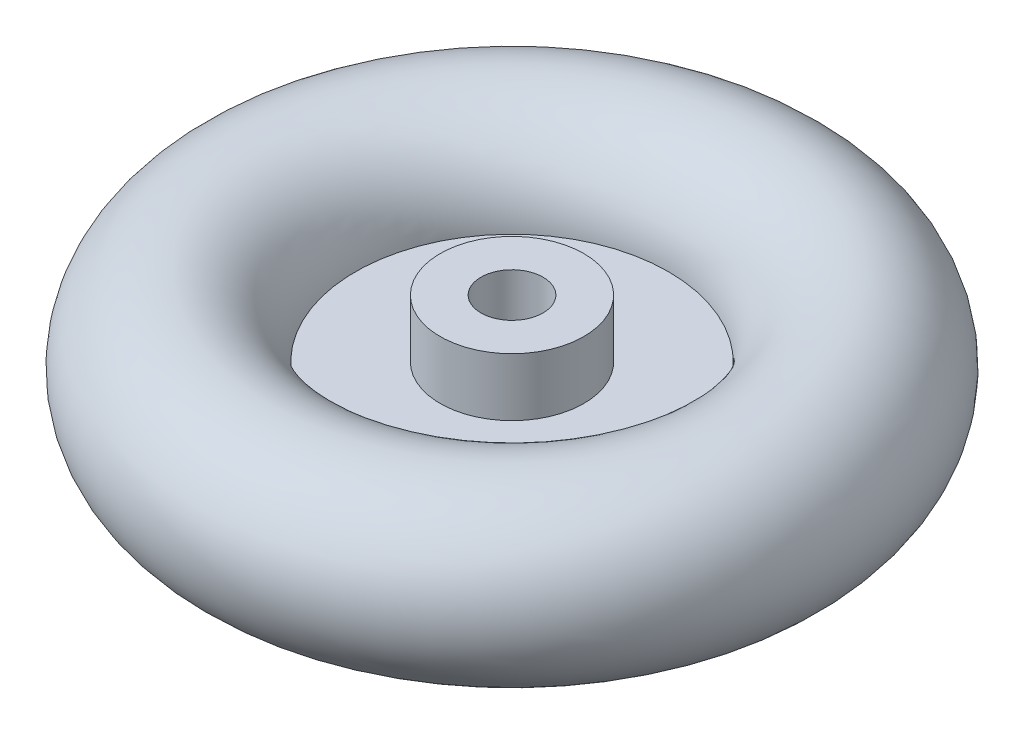
ISO-10303-21;
HEADER;
FILE_DESCRIPTION(('STEP AP214'),'2;1');
FILE_NAME('part.step','',(''),(''),'','','');
FILE_SCHEMA(('AUTOMOTIVE_DESIGN { 1 0 10303 214 1 1 1 1 }'));
ENDSEC;
DATA;
#1=APPLICATION_CONTEXT('core data for automotive mechanical design processes');
#2=APPLICATION_PROTOCOL_DEFINITION('international standard','automotive_design',2000,#1);
#3=PRODUCT_CONTEXT('',#1,'mechanical');
#4=PRODUCT('Part','Part','',(#3));
#5=PRODUCT_RELATED_PRODUCT_CATEGORY('part','',(#4));
#6=PRODUCT_DEFINITION_FORMATION('','',#4);
#7=PRODUCT_DEFINITION_CONTEXT('part definition',#1,'design');
#8=PRODUCT_DEFINITION('design','',#6,#7);
#9=PRODUCT_DEFINITION_SHAPE('','',#8);
#10=(LENGTH_UNIT() NAMED_UNIT(*) SI_UNIT(.MILLI.,.METRE.));
#11=(NAMED_UNIT(*) PLANE_ANGLE_UNIT() SI_UNIT($,.RADIAN.));
#12=(NAMED_UNIT(*) SI_UNIT($,.STERADIAN.) SOLID_ANGLE_UNIT());
#13=UNCERTAINTY_MEASURE_WITH_UNIT(LENGTH_MEASURE(1.E-05),#10,'distance_accuracy_value','');
#14=(GEOMETRIC_REPRESENTATION_CONTEXT(3) GLOBAL_UNCERTAINTY_ASSIGNED_CONTEXT((#13)) GLOBAL_UNIT_ASSIGNED_CONTEXT((#10,
#11,#12)) REPRESENTATION_CONTEXT('',''));
#15=CARTESIAN_POINT('',(0.,0.,0.));
#16=DIRECTION('',(0.,0.,1.));
#17=DIRECTION('',(1.,0.,0.));
#18=AXIS2_PLACEMENT_3D('',#15,#16,#17);
#19=CARTESIAN_POINT('',(-6.38024824366239,0.539107048537545,0.));
#20=DIRECTION('',(0.,-1.,0.));
#21=DIRECTION('',(0.,0.,-1.));
#22=AXIS2_PLACEMENT_3D('',#19,#20,#21);
#23=CYLINDRICAL_SURFACE('',#22,22.);
#24=CARTESIAN_POINT('',(-6.38024824366239,28.2494507563892,0.));
#25=DIRECTION('',(0.,-1.,0.));
#26=DIRECTION('',(0.,0.,-1.));
#27=AXIS2_PLACEMENT_3D('',#24,#25,#26);
#28=CIRCLE('',#27,22.);
#29=CARTESIAN_POINT('',(-6.38024824366239,28.2494507563892,-22.));
#30=VERTEX_POINT('',#29);
#31=EDGE_CURVE('E10',#30,#30,#28,.T.);
#32=ORIENTED_EDGE('',*,*,#31,.F.);
#33=EDGE_LOOP('',(#32));
#34=FACE_BOUND('',#33,.T.);
#35=CARTESIAN_POINT('',(-6.38024824366239,46.,0.));
#36=DIRECTION('',(0.,-1.,0.));
#37=DIRECTION('',(0.,0.,-1.));
#38=AXIS2_PLACEMENT_3D('',#35,#36,#37);
#39=CIRCLE('',#38,22.);
#40=CARTESIAN_POINT('',(-6.38024824366239,46.,-22.));
#41=VERTEX_POINT('',#40);
#42=EDGE_CURVE('E64',#41,#41,#39,.T.);
#43=ORIENTED_EDGE('',*,*,#42,.T.);
#44=EDGE_LOOP('',(#43));
#45=FACE_BOUND('',#44,.T.);
#46=ADVANCED_FACE('F36',(#34,#45),#23,.T.);
#47=CARTESIAN_POINT('',(15.6197517563376,28.2494507563892,0.));
#48=DIRECTION('',(0.,-1.,0.));
#49=DIRECTION('',(0.,0.,-1.));
#50=AXIS2_PLACEMENT_3D('',#47,#48,#49);
#51=PLANE('',#50);
#52=CARTESIAN_POINT('',(-6.38024824366239,28.2494507563892,0.));
#53=DIRECTION('',(0.,-1.,0.));
#54=DIRECTION('',(0.,0.,-1.));
#55=AXIS2_PLACEMENT_3D('',#52,#53,#54);
#56=CIRCLE('',#55,47.8952228062732);
#57=CARTESIAN_POINT('',(-6.38024824366239,28.2494507563892,-47.8952228062732));
#58=VERTEX_POINT('',#57);
#59=EDGE_CURVE('E42',#58,#58,#56,.T.);
#60=ORIENTED_EDGE('',*,*,#59,.F.);
#61=EDGE_LOOP('',(#60));
#62=FACE_BOUND('',#61,.T.);
#63=ORIENTED_EDGE('',*,*,#31,.T.);
#64=EDGE_LOOP('',(#63));
#65=FACE_BOUND('',#64,.T.);
#66=ADVANCED_FACE('F81',(#62,#65),#51,.F.);
#67=CARTESIAN_POINT('',(-6.38024824366239,26.9234347195209,0.));
#68=DIRECTION('',(0.,-1.,0.));
#69=DIRECTION('',(0.,0.,-1.));
#70=AXIS2_PLACEMENT_3D('',#67,#68,#69);
#71=TOROIDAL_SURFACE('',#70,74.3786348956125,26.5165879106607);
#72=CARTESIAN_POINT('',(-6.38024824366239,25.5974186826527,0.));
#73=DIRECTION('',(0.,-1.,0.));
#74=DIRECTION('',(0.,0.,-1.));
#75=AXIS2_PLACEMENT_3D('',#72,#73,#74);
#76=CIRCLE('',#75,47.8952228062732);
#77=CARTESIAN_POINT('',(-6.38024824366239,25.5974186826527,-47.8952228062732));
#78=VERTEX_POINT('',#77);
#79=EDGE_CURVE('E46',#78,#78,#76,.T.);
#80=ORIENTED_EDGE('',*,*,#79,.F.);
#81=EDGE_LOOP('',(#80));
#82=FACE_BOUND('',#81,.T.);
#83=ORIENTED_EDGE('',*,*,#59,.T.);
#84=EDGE_LOOP('',(#83));
#85=FACE_BOUND('',#84,.T.);
#86=ADVANCED_FACE('F86',(#82,#85),#71,.T.);
#87=CARTESIAN_POINT('',(41.5149745626108,25.5974186826527,0.));
#88=DIRECTION('',(0.,1.,0.));
#89=DIRECTION('',(0.,0.,1.));
#90=AXIS2_PLACEMENT_3D('',#87,#88,#89);
#91=PLANE('',#90);
#92=CARTESIAN_POINT('',(-6.38024824366239,25.5974186826527,0.));
#93=DIRECTION('',(0.,-1.,0.));
#94=DIRECTION('',(0.,0.,-1.));
#95=AXIS2_PLACEMENT_3D('',#92,#93,#94);
#96=CIRCLE('',#95,22.);
#97=CARTESIAN_POINT('',(-6.38024824366239,25.5974186826527,-22.));
#98=VERTEX_POINT('',#97);
#99=EDGE_CURVE('E50',#98,#98,#96,.T.);
#100=ORIENTED_EDGE('',*,*,#99,.F.);
#101=EDGE_LOOP('',(#100));
#102=FACE_BOUND('',#101,.T.);
#103=ORIENTED_EDGE('',*,*,#79,.T.);
#104=EDGE_LOOP('',(#103));
#105=FACE_BOUND('',#104,.T.);
#106=ADVANCED_FACE('F91',(#102,#105),#91,.F.);
#107=CARTESIAN_POINT('',(-6.38024824366239,0.539107048537545,0.));
#108=DIRECTION('',(0.,-1.,0.));
#109=DIRECTION('',(0.,0.,-1.));
#110=AXIS2_PLACEMENT_3D('',#107,#108,#109);
#111=CYLINDRICAL_SURFACE('',#110,22.);
#112=CARTESIAN_POINT('',(-6.38024824366239,0.,0.));
#113=DIRECTION('',(0.,-1.,0.));
#114=DIRECTION('',(0.,0.,-1.));
#115=AXIS2_PLACEMENT_3D('',#112,#113,#114);
#116=CIRCLE('',#115,22.);
#117=CARTESIAN_POINT('',(-6.38024824366239,0.,-22.));
#118=VERTEX_POINT('',#117);
#119=EDGE_CURVE('E55',#118,#118,#116,.T.);
#120=ORIENTED_EDGE('',*,*,#119,.F.);
#121=EDGE_LOOP('',(#120));
#122=FACE_BOUND('',#121,.T.);
#123=ORIENTED_EDGE('',*,*,#99,.T.);
#124=EDGE_LOOP('',(#123));
#125=FACE_BOUND('',#124,.T.);
#126=ADVANCED_FACE('F97',(#122,#125),#111,.T.);
#127=CARTESIAN_POINT('',(3.11975175633761,0.,0.));
#128=DIRECTION('',(0.,-1.,0.));
#129=DIRECTION('',(0.,0.,-1.));
#130=AXIS2_PLACEMENT_3D('',#127,#128,#129);
#131=PLANE('',#130);
#132=ORIENTED_EDGE('',*,*,#119,.T.);
#133=EDGE_LOOP('',(#132));
#134=FACE_BOUND('',#133,.T.);
#135=CARTESIAN_POINT('',(-6.38024824366239,0.,0.));
#136=DIRECTION('',(0.,-1.,0.));
#137=DIRECTION('',(0.,0.,-1.));
#138=AXIS2_PLACEMENT_3D('',#135,#136,#137);
#139=CIRCLE('',#138,9.49999999999999);
#140=CARTESIAN_POINT('',(-6.38024824366239,0.,-9.49999999999999));
#141=VERTEX_POINT('',#140);
#142=EDGE_CURVE('E58',#141,#141,#139,.T.);
#143=ORIENTED_EDGE('',*,*,#142,.F.);
#144=EDGE_LOOP('',(#143));
#145=FACE_BOUND('',#144,.T.);
#146=ADVANCED_FACE('F77',(#134,#145),#131,.T.);
#147=CARTESIAN_POINT('',(-6.38024824366239,0.539107048537545,0.));
#148=DIRECTION('',(0.,-1.,0.));
#149=DIRECTION('',(0.,0.,-1.));
#150=AXIS2_PLACEMENT_3D('',#147,#148,#149);
#151=CYLINDRICAL_SURFACE('',#150,9.49999999999999);
#152=ORIENTED_EDGE('',*,*,#142,.T.);
#153=EDGE_LOOP('',(#152));
#154=FACE_BOUND('',#153,.T.);
#155=CARTESIAN_POINT('',(-6.38024824366239,46.,0.));
#156=DIRECTION('',(0.,-1.,0.));
#157=DIRECTION('',(0.,0.,-1.));
#158=AXIS2_PLACEMENT_3D('',#155,#156,#157);
#159=CIRCLE('',#158,9.49999999999999);
#160=CARTESIAN_POINT('',(-6.38024824366239,46.,-9.49999999999999));
#161=VERTEX_POINT('',#160);
#162=EDGE_CURVE('E61',#161,#161,#159,.T.);
#163=ORIENTED_EDGE('',*,*,#162,.F.);
#164=EDGE_LOOP('',(#163));
#165=FACE_BOUND('',#164,.T.);
#166=ADVANCED_FACE('F71',(#154,#165),#151,.F.);
#167=CARTESIAN_POINT('',(15.6197517563376,46.,0.));
#168=DIRECTION('',(0.,1.,0.));
#169=DIRECTION('',(0.,0.,1.));
#170=AXIS2_PLACEMENT_3D('',#167,#168,#169);
#171=PLANE('',#170);
#172=ORIENTED_EDGE('',*,*,#162,.T.);
#173=EDGE_LOOP('',(#172));
#174=FACE_BOUND('',#173,.T.);
#175=ORIENTED_EDGE('',*,*,#42,.F.);
#176=EDGE_LOOP('',(#175));
#177=FACE_BOUND('',#176,.T.);
#178=ADVANCED_FACE('F69',(#174,#177),#171,.T.);
#179=CLOSED_SHELL('',(#46,#66,#86,#106,#126,#146,#166,#178));
#180=MANIFOLD_SOLID_BREP('B2',#179);
#181=ADVANCED_BREP_SHAPE_REPRESENTATION('',(#18,#180),#14);
#182=SHAPE_DEFINITION_REPRESENTATION(#9,#181);
ENDSEC;
END-ISO-10303-21;
